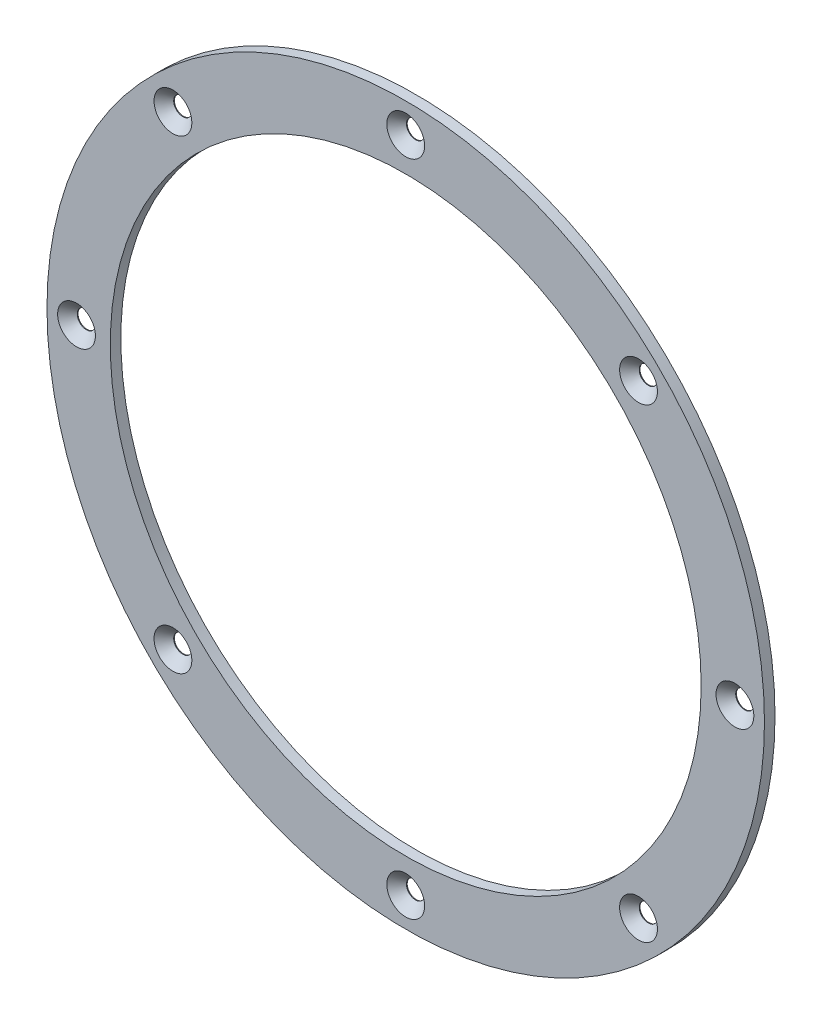
ISO-10303-21;
HEADER;
FILE_DESCRIPTION(('STEP AP214'),'2;1');
FILE_NAME('part.step','',(''),(''),'','','');
FILE_SCHEMA(('AUTOMOTIVE_DESIGN { 1 0 10303 214 1 1 1 1 }'));
ENDSEC;
DATA;
#1=APPLICATION_CONTEXT('core data for automotive mechanical design processes');
#2=APPLICATION_PROTOCOL_DEFINITION('international standard','automotive_design',2000,#1);
#3=PRODUCT_CONTEXT('',#1,'mechanical');
#4=PRODUCT('Part','Part','',(#3));
#5=PRODUCT_RELATED_PRODUCT_CATEGORY('part','',(#4));
#6=PRODUCT_DEFINITION_FORMATION('','',#4);
#7=PRODUCT_DEFINITION_CONTEXT('part definition',#1,'design');
#8=PRODUCT_DEFINITION('design','',#6,#7);
#9=PRODUCT_DEFINITION_SHAPE('','',#8);
#10=(LENGTH_UNIT() NAMED_UNIT(*) SI_UNIT(.MILLI.,.METRE.));
#11=(NAMED_UNIT(*) PLANE_ANGLE_UNIT() SI_UNIT($,.RADIAN.));
#12=(NAMED_UNIT(*) SI_UNIT($,.STERADIAN.) SOLID_ANGLE_UNIT());
#13=UNCERTAINTY_MEASURE_WITH_UNIT(LENGTH_MEASURE(1.E-05),#10,'distance_accuracy_value','');
#14=(GEOMETRIC_REPRESENTATION_CONTEXT(3) GLOBAL_UNCERTAINTY_ASSIGNED_CONTEXT((#13)) GLOBAL_UNIT_ASSIGNED_CONTEXT((#10,
#11,#12)) REPRESENTATION_CONTEXT('',''));
#15=CARTESIAN_POINT('',(0.,0.,0.));
#16=DIRECTION('',(0.,0.,1.));
#17=DIRECTION('',(1.,0.,0.));
#18=AXIS2_PLACEMENT_3D('',#15,#16,#17);
#19=CARTESIAN_POINT('',(0.,0.,-1.7));
#20=DIRECTION('',(0.,0.,1.));
#21=DIRECTION('',(1.,0.,0.));
#22=AXIS2_PLACEMENT_3D('',#19,#20,#21);
#23=PLANE('',#22);
#24=CARTESIAN_POINT('',(55.15432893255,55.1543289325514,-1.7));
#25=DIRECTION('',(0.,0.,1.));
#26=DIRECTION('',(1.,0.,0.));
#27=AXIS2_PLACEMENT_3D('',#24,#25,#26);
#28=CIRCLE('',#27,2.15);
#29=CARTESIAN_POINT('',(57.30432893255,55.1543289325514,-1.7));
#30=VERTEX_POINT('',#29);
#31=EDGE_CURVE('E350',#30,#30,#28,.T.);
#32=ORIENTED_EDGE('',*,*,#31,.T.);
#33=EDGE_LOOP('',(#32));
#34=FACE_BOUND('',#33,.T.);
#35=CARTESIAN_POINT('',(78.,8.17006633289293E-13,-1.7));
#36=DIRECTION('',(0.,0.,1.));
#37=DIRECTION('',(1.,0.,0.));
#38=AXIS2_PLACEMENT_3D('',#35,#36,#37);
#39=CIRCLE('',#38,2.15);
#40=CARTESIAN_POINT('',(80.15,8.17006633289293E-13,-1.7));
#41=VERTEX_POINT('',#40);
#42=EDGE_CURVE('E341',#41,#41,#39,.T.);
#43=ORIENTED_EDGE('',*,*,#42,.T.);
#44=EDGE_LOOP('',(#43));
#45=FACE_BOUND('',#44,.T.);
#46=CARTESIAN_POINT('',(55.1543289325512,-55.1543289325502,-1.7));
#47=DIRECTION('',(0.,0.,1.));
#48=DIRECTION('',(1.,0.,0.));
#49=AXIS2_PLACEMENT_3D('',#46,#47,#48);
#50=CIRCLE('',#49,2.15);
#51=CARTESIAN_POINT('',(57.3043289325512,-55.1543289325502,-1.7));
#52=VERTEX_POINT('',#51);
#53=EDGE_CURVE('E332',#52,#52,#50,.T.);
#54=ORIENTED_EDGE('',*,*,#53,.T.);
#55=EDGE_LOOP('',(#54));
#56=FACE_BOUND('',#55,.T.);
#57=CARTESIAN_POINT('',(0.,-78.,-1.7));
#58=DIRECTION('',(0.,0.,1.));
#59=DIRECTION('',(1.,0.,0.));
#60=AXIS2_PLACEMENT_3D('',#57,#58,#59);
#61=CIRCLE('',#60,2.15);
#62=CARTESIAN_POINT('',(2.15,-78.,-1.7));
#63=VERTEX_POINT('',#62);
#64=EDGE_CURVE('E323',#63,#63,#61,.T.);
#65=ORIENTED_EDGE('',*,*,#64,.T.);
#66=EDGE_LOOP('',(#65));
#67=FACE_BOUND('',#66,.T.);
#68=CARTESIAN_POINT('',(-55.1543289325504,-55.154328932551,-1.7));
#69=DIRECTION('',(0.,0.,1.));
#70=DIRECTION('',(1.,0.,0.));
#71=AXIS2_PLACEMENT_3D('',#68,#69,#70);
#72=CIRCLE('',#71,2.15);
#73=CARTESIAN_POINT('',(-53.0043289325504,-55.154328932551,-1.7));
#74=VERTEX_POINT('',#73);
#75=EDGE_CURVE('E314',#74,#74,#72,.T.);
#76=ORIENTED_EDGE('',*,*,#75,.T.);
#77=EDGE_LOOP('',(#76));
#78=FACE_BOUND('',#77,.T.);
#79=CARTESIAN_POINT('',(-78.,-2.72335544429764E-13,-1.7));
#80=DIRECTION('',(0.,0.,1.));
#81=DIRECTION('',(1.,0.,0.));
#82=AXIS2_PLACEMENT_3D('',#79,#80,#81);
#83=CIRCLE('',#82,2.15);
#84=CARTESIAN_POINT('',(-75.85,-2.72335544429764E-13,-1.7));
#85=VERTEX_POINT('',#84);
#86=EDGE_CURVE('E305',#85,#85,#83,.T.);
#87=ORIENTED_EDGE('',*,*,#86,.T.);
#88=EDGE_LOOP('',(#87));
#89=FACE_BOUND('',#88,.T.);
#90=CARTESIAN_POINT('',(-55.1543289325508,55.1543289325506,-1.7));
#91=DIRECTION('',(0.,0.,1.));
#92=DIRECTION('',(1.,0.,0.));
#93=AXIS2_PLACEMENT_3D('',#90,#91,#92);
#94=CIRCLE('',#93,2.15);
#95=CARTESIAN_POINT('',(-53.0043289325508,55.1543289325506,-1.7));
#96=VERTEX_POINT('',#95);
#97=EDGE_CURVE('E294',#96,#96,#94,.T.);
#98=ORIENTED_EDGE('',*,*,#97,.T.);
#99=EDGE_LOOP('',(#98));
#100=FACE_BOUND('',#99,.T.);
#101=CARTESIAN_POINT('',(0.,78.,-1.7));
#102=DIRECTION('',(0.,0.,1.));
#103=DIRECTION('',(1.,0.,0.));
#104=AXIS2_PLACEMENT_3D('',#101,#102,#103);
#105=CIRCLE('',#104,2.15);
#106=CARTESIAN_POINT('',(2.15,78.,-1.7));
#107=VERTEX_POINT('',#106);
#108=EDGE_CURVE('E82',#107,#107,#105,.T.);
#109=ORIENTED_EDGE('',*,*,#108,.T.);
#110=EDGE_LOOP('',(#109));
#111=FACE_BOUND('',#110,.T.);
#112=CARTESIAN_POINT('',(0.,0.,-1.7));
#113=DIRECTION('',(0.,0.,1.));
#114=DIRECTION('',(1.,0.,0.));
#115=AXIS2_PLACEMENT_3D('',#112,#113,#114);
#116=CIRCLE('',#115,70.);
#117=CARTESIAN_POINT('',(70.,0.,-1.7));
#118=VERTEX_POINT('',#117);
#119=EDGE_CURVE('E70',#118,#118,#116,.T.);
#120=ORIENTED_EDGE('',*,*,#119,.T.);
#121=EDGE_LOOP('',(#120));
#122=FACE_BOUND('',#121,.T.);
#123=CARTESIAN_POINT('',(0.,0.,-1.7));
#124=DIRECTION('',(0.,0.,1.));
#125=DIRECTION('',(1.,0.,0.));
#126=AXIS2_PLACEMENT_3D('',#123,#124,#125);
#127=CIRCLE('',#126,85.);
#128=CARTESIAN_POINT('',(85.,0.,-1.7));
#129=VERTEX_POINT('',#128);
#130=EDGE_CURVE('E13',#129,#129,#127,.T.);
#131=ORIENTED_EDGE('',*,*,#130,.F.);
#132=EDGE_LOOP('',(#131));
#133=FACE_BOUND('',#132,.T.);
#134=ADVANCED_FACE('F55',(#34,#45,#56,#67,#78,#89,#100,#111,#122,#133),#23,.F.);
#135=CARTESIAN_POINT('',(0.,0.,0.8));
#136=DIRECTION('',(0.,0.,1.));
#137=DIRECTION('',(1.,0.,0.));
#138=AXIS2_PLACEMENT_3D('',#135,#136,#137);
#139=PLANE('',#138);
#140=CARTESIAN_POINT('',(55.15432893255,55.1543289325514,0.8));
#141=DIRECTION('',(0.,0.,1.));
#142=DIRECTION('',(1.,0.,0.));
#143=AXIS2_PLACEMENT_3D('',#140,#141,#142);
#144=CIRCLE('',#143,4.48);
#145=CARTESIAN_POINT('',(59.63432893255,55.1543289325514,0.8));
#146=VERTEX_POINT('',#145);
#147=EDGE_CURVE('E356',#146,#146,#144,.T.);
#148=ORIENTED_EDGE('',*,*,#147,.F.);
#149=EDGE_LOOP('',(#148));
#150=FACE_BOUND('',#149,.T.);
#151=CARTESIAN_POINT('',(78.,8.17006633289293E-13,0.8));
#152=DIRECTION('',(0.,0.,1.));
#153=DIRECTION('',(1.,0.,0.));
#154=AXIS2_PLACEMENT_3D('',#151,#152,#153);
#155=CIRCLE('',#154,4.48);
#156=CARTESIAN_POINT('',(82.48,8.17006633289293E-13,0.8));
#157=VERTEX_POINT('',#156);
#158=EDGE_CURVE('E347',#157,#157,#155,.T.);
#159=ORIENTED_EDGE('',*,*,#158,.F.);
#160=EDGE_LOOP('',(#159));
#161=FACE_BOUND('',#160,.T.);
#162=CARTESIAN_POINT('',(55.1543289325512,-55.1543289325502,0.8));
#163=DIRECTION('',(0.,0.,1.));
#164=DIRECTION('',(1.,0.,0.));
#165=AXIS2_PLACEMENT_3D('',#162,#163,#164);
#166=CIRCLE('',#165,4.48);
#167=CARTESIAN_POINT('',(59.6343289325512,-55.1543289325502,0.8));
#168=VERTEX_POINT('',#167);
#169=EDGE_CURVE('E338',#168,#168,#166,.T.);
#170=ORIENTED_EDGE('',*,*,#169,.F.);
#171=EDGE_LOOP('',(#170));
#172=FACE_BOUND('',#171,.T.);
#173=CARTESIAN_POINT('',(0.,-78.,0.8));
#174=DIRECTION('',(0.,0.,1.));
#175=DIRECTION('',(1.,0.,0.));
#176=AXIS2_PLACEMENT_3D('',#173,#174,#175);
#177=CIRCLE('',#176,4.48);
#178=CARTESIAN_POINT('',(4.48,-78.,0.8));
#179=VERTEX_POINT('',#178);
#180=EDGE_CURVE('E329',#179,#179,#177,.T.);
#181=ORIENTED_EDGE('',*,*,#180,.F.);
#182=EDGE_LOOP('',(#181));
#183=FACE_BOUND('',#182,.T.);
#184=CARTESIAN_POINT('',(-55.1543289325504,-55.154328932551,0.8));
#185=DIRECTION('',(0.,0.,1.));
#186=DIRECTION('',(1.,0.,0.));
#187=AXIS2_PLACEMENT_3D('',#184,#185,#186);
#188=CIRCLE('',#187,4.48);
#189=CARTESIAN_POINT('',(-50.6743289325504,-55.154328932551,0.8));
#190=VERTEX_POINT('',#189);
#191=EDGE_CURVE('E320',#190,#190,#188,.T.);
#192=ORIENTED_EDGE('',*,*,#191,.F.);
#193=EDGE_LOOP('',(#192));
#194=FACE_BOUND('',#193,.T.);
#195=CARTESIAN_POINT('',(-78.,-2.72335544429764E-13,0.8));
#196=DIRECTION('',(0.,0.,1.));
#197=DIRECTION('',(1.,0.,0.));
#198=AXIS2_PLACEMENT_3D('',#195,#196,#197);
#199=CIRCLE('',#198,4.48);
#200=CARTESIAN_POINT('',(-73.52,-2.72335544429764E-13,0.8));
#201=VERTEX_POINT('',#200);
#202=EDGE_CURVE('E311',#201,#201,#199,.T.);
#203=ORIENTED_EDGE('',*,*,#202,.F.);
#204=EDGE_LOOP('',(#203));
#205=FACE_BOUND('',#204,.T.);
#206=CARTESIAN_POINT('',(-55.1543289325508,55.1543289325506,0.8));
#207=DIRECTION('',(0.,0.,1.));
#208=DIRECTION('',(1.,0.,0.));
#209=AXIS2_PLACEMENT_3D('',#206,#207,#208);
#210=CIRCLE('',#209,4.48);
#211=CARTESIAN_POINT('',(-50.6743289325508,55.1543289325506,0.8));
#212=VERTEX_POINT('',#211);
#213=EDGE_CURVE('E302',#212,#212,#210,.T.);
#214=ORIENTED_EDGE('',*,*,#213,.F.);
#215=EDGE_LOOP('',(#214));
#216=FACE_BOUND('',#215,.T.);
#217=CARTESIAN_POINT('',(0.,78.,0.8));
#218=DIRECTION('',(0.,0.,1.));
#219=DIRECTION('',(1.,0.,0.));
#220=AXIS2_PLACEMENT_3D('',#217,#218,#219);
#221=CIRCLE('',#220,4.48);
#222=CARTESIAN_POINT('',(4.48,78.,0.8));
#223=VERTEX_POINT('',#222);
#224=EDGE_CURVE('E290',#223,#223,#221,.T.);
#225=ORIENTED_EDGE('',*,*,#224,.F.);
#226=EDGE_LOOP('',(#225));
#227=FACE_BOUND('',#226,.T.);
#228=CARTESIAN_POINT('',(0.,0.,0.8));
#229=DIRECTION('',(0.,0.,1.));
#230=DIRECTION('',(1.,0.,0.));
#231=AXIS2_PLACEMENT_3D('',#228,#229,#230);
#232=CIRCLE('',#231,70.);
#233=CARTESIAN_POINT('',(70.,0.,0.8));
#234=VERTEX_POINT('',#233);
#235=EDGE_CURVE('E78',#234,#234,#232,.T.);
#236=ORIENTED_EDGE('',*,*,#235,.F.);
#237=EDGE_LOOP('',(#236));
#238=FACE_BOUND('',#237,.T.);
#239=CARTESIAN_POINT('',(0.,0.,0.8));
#240=DIRECTION('',(0.,0.,1.));
#241=DIRECTION('',(1.,0.,0.));
#242=AXIS2_PLACEMENT_3D('',#239,#240,#241);
#243=CIRCLE('',#242,85.);
#244=CARTESIAN_POINT('',(85.,0.,0.8));
#245=VERTEX_POINT('',#244);
#246=EDGE_CURVE('E62',#245,#245,#243,.T.);
#247=ORIENTED_EDGE('',*,*,#246,.T.);
#248=EDGE_LOOP('',(#247));
#249=FACE_BOUND('',#248,.T.);
#250=ADVANCED_FACE('F362',(#150,#161,#172,#183,#194,#205,#216,#227,#238,#249),#139,.T.);
#251=CARTESIAN_POINT('',(0.,0.,0.8));
#252=DIRECTION('',(0.,0.,-1.));
#253=DIRECTION('',(-1.,0.,0.));
#254=AXIS2_PLACEMENT_3D('',#251,#252,#253);
#255=CYLINDRICAL_SURFACE('',#254,85.);
#256=ORIENTED_EDGE('',*,*,#130,.T.);
#257=EDGE_LOOP('',(#256));
#258=FACE_BOUND('',#257,.T.);
#259=ORIENTED_EDGE('',*,*,#246,.F.);
#260=EDGE_LOOP('',(#259));
#261=FACE_BOUND('',#260,.T.);
#262=ADVANCED_FACE('F365',(#258,#261),#255,.T.);
#263=CARTESIAN_POINT('',(0.,0.,0.8));
#264=DIRECTION('',(0.,0.,-1.));
#265=DIRECTION('',(-1.,0.,0.));
#266=AXIS2_PLACEMENT_3D('',#263,#264,#265);
#267=CYLINDRICAL_SURFACE('',#266,70.);
#268=ORIENTED_EDGE('',*,*,#119,.F.);
#269=EDGE_LOOP('',(#268));
#270=FACE_BOUND('',#269,.T.);
#271=ORIENTED_EDGE('',*,*,#235,.T.);
#272=EDGE_LOOP('',(#271));
#273=FACE_BOUND('',#272,.T.);
#274=ADVANCED_FACE('F395',(#270,#273),#267,.F.);
#275=CARTESIAN_POINT('',(0.,78.,0.8));
#276=DIRECTION('',(0.,0.,1.));
#277=DIRECTION('',(1.,0.,0.));
#278=AXIS2_PLACEMENT_3D('',#275,#276,#277);
#279=CYLINDRICAL_SURFACE('',#278,2.15);
#280=ORIENTED_EDGE('',*,*,#108,.F.);
#281=EDGE_LOOP('',(#280));
#282=FACE_BOUND('',#281,.T.);
#283=CARTESIAN_POINT('',(0.,78.,-1.53));
#284=DIRECTION('',(0.,0.,1.));
#285=DIRECTION('',(1.,0.,0.));
#286=AXIS2_PLACEMENT_3D('',#283,#284,#285);
#287=CIRCLE('',#286,2.15);
#288=CARTESIAN_POINT('',(2.15,78.,-1.53));
#289=VERTEX_POINT('',#288);
#290=EDGE_CURVE('E286',#289,#289,#287,.T.);
#291=ORIENTED_EDGE('',*,*,#290,.T.);
#292=EDGE_LOOP('',(#291));
#293=FACE_BOUND('',#292,.T.);
#294=ADVANCED_FACE('F385',(#282,#293),#279,.F.);
#295=CARTESIAN_POINT('',(0.,78.,0.8));
#296=DIRECTION('',(0.,0.,1.));
#297=DIRECTION('',(1.,0.,0.));
#298=AXIS2_PLACEMENT_3D('',#295,#296,#297);
#299=CONICAL_SURFACE('',#298,4.48,0.785398163397448);
#300=ORIENTED_EDGE('',*,*,#290,.F.);
#301=EDGE_LOOP('',(#300));
#302=FACE_BOUND('',#301,.T.);
#303=ORIENTED_EDGE('',*,*,#224,.T.);
#304=EDGE_LOOP('',(#303));
#305=FACE_BOUND('',#304,.T.);
#306=ADVANCED_FACE('F382',(#302,#305),#299,.F.);
#307=CARTESIAN_POINT('',(-55.1543289325508,55.1543289325506,0.8));
#308=DIRECTION('',(0.,0.,1.));
#309=DIRECTION('',(1.,0.,0.));
#310=AXIS2_PLACEMENT_3D('',#307,#308,#309);
#311=CYLINDRICAL_SURFACE('',#310,2.15);
#312=ORIENTED_EDGE('',*,*,#97,.F.);
#313=EDGE_LOOP('',(#312));
#314=FACE_BOUND('',#313,.T.);
#315=CARTESIAN_POINT('',(-55.1543289325508,55.1543289325506,-1.53));
#316=DIRECTION('',(0.,0.,1.));
#317=DIRECTION('',(1.,0.,0.));
#318=AXIS2_PLACEMENT_3D('',#315,#316,#317);
#319=CIRCLE('',#318,2.15);
#320=CARTESIAN_POINT('',(-53.0043289325508,55.1543289325506,-1.53));
#321=VERTEX_POINT('',#320);
#322=EDGE_CURVE('E299',#321,#321,#319,.T.);
#323=ORIENTED_EDGE('',*,*,#322,.T.);
#324=EDGE_LOOP('',(#323));
#325=FACE_BOUND('',#324,.T.);
#326=ADVANCED_FACE('F384',(#314,#325),#311,.F.);
#327=CARTESIAN_POINT('',(-55.1543289325508,55.1543289325506,0.8));
#328=DIRECTION('',(0.,0.,1.));
#329=DIRECTION('',(1.,0.,0.));
#330=AXIS2_PLACEMENT_3D('',#327,#328,#329);
#331=CONICAL_SURFACE('',#330,4.48,0.785398163397448);
#332=ORIENTED_EDGE('',*,*,#322,.F.);
#333=EDGE_LOOP('',(#332));
#334=FACE_BOUND('',#333,.T.);
#335=ORIENTED_EDGE('',*,*,#213,.T.);
#336=EDGE_LOOP('',(#335));
#337=FACE_BOUND('',#336,.T.);
#338=ADVANCED_FACE('F392',(#334,#337),#331,.F.);
#339=CARTESIAN_POINT('',(-78.,-2.72335544429764E-13,0.8));
#340=DIRECTION('',(0.,0.,1.));
#341=DIRECTION('',(1.,0.,0.));
#342=AXIS2_PLACEMENT_3D('',#339,#340,#341);
#343=CYLINDRICAL_SURFACE('',#342,2.15);
#344=ORIENTED_EDGE('',*,*,#86,.F.);
#345=EDGE_LOOP('',(#344));
#346=FACE_BOUND('',#345,.T.);
#347=CARTESIAN_POINT('',(-78.,-2.72335544429764E-13,-1.53));
#348=DIRECTION('',(0.,0.,1.));
#349=DIRECTION('',(1.,0.,0.));
#350=AXIS2_PLACEMENT_3D('',#347,#348,#349);
#351=CIRCLE('',#350,2.15);
#352=CARTESIAN_POINT('',(-75.85,-2.72335544429764E-13,-1.53));
#353=VERTEX_POINT('',#352);
#354=EDGE_CURVE('E308',#353,#353,#351,.T.);
#355=ORIENTED_EDGE('',*,*,#354,.T.);
#356=EDGE_LOOP('',(#355));
#357=FACE_BOUND('',#356,.T.);
#358=ADVANCED_FACE('F450',(#346,#357),#343,.F.);
#359=CARTESIAN_POINT('',(-78.,-2.72335544429764E-13,0.8));
#360=DIRECTION('',(0.,0.,1.));
#361=DIRECTION('',(1.,0.,0.));
#362=AXIS2_PLACEMENT_3D('',#359,#360,#361);
#363=CONICAL_SURFACE('',#362,4.48,0.785398163397448);
#364=ORIENTED_EDGE('',*,*,#354,.F.);
#365=EDGE_LOOP('',(#364));
#366=FACE_BOUND('',#365,.T.);
#367=ORIENTED_EDGE('',*,*,#202,.T.);
#368=EDGE_LOOP('',(#367));
#369=FACE_BOUND('',#368,.T.);
#370=ADVANCED_FACE('F461',(#366,#369),#363,.F.);
#371=CARTESIAN_POINT('',(-55.1543289325504,-55.154328932551,0.8));
#372=DIRECTION('',(0.,0.,1.));
#373=DIRECTION('',(1.,0.,0.));
#374=AXIS2_PLACEMENT_3D('',#371,#372,#373);
#375=CYLINDRICAL_SURFACE('',#374,2.15);
#376=ORIENTED_EDGE('',*,*,#75,.F.);
#377=EDGE_LOOP('',(#376));
#378=FACE_BOUND('',#377,.T.);
#379=CARTESIAN_POINT('',(-55.1543289325504,-55.154328932551,-1.53));
#380=DIRECTION('',(0.,0.,1.));
#381=DIRECTION('',(1.,0.,0.));
#382=AXIS2_PLACEMENT_3D('',#379,#380,#381);
#383=CIRCLE('',#382,2.15);
#384=CARTESIAN_POINT('',(-53.0043289325504,-55.154328932551,-1.53));
#385=VERTEX_POINT('',#384);
#386=EDGE_CURVE('E317',#385,#385,#383,.T.);
#387=ORIENTED_EDGE('',*,*,#386,.T.);
#388=EDGE_LOOP('',(#387));
#389=FACE_BOUND('',#388,.T.);
#390=ADVANCED_FACE('F472',(#378,#389),#375,.F.);
#391=CARTESIAN_POINT('',(-55.1543289325504,-55.154328932551,0.8));
#392=DIRECTION('',(0.,0.,1.));
#393=DIRECTION('',(1.,0.,0.));
#394=AXIS2_PLACEMENT_3D('',#391,#392,#393);
#395=CONICAL_SURFACE('',#394,4.48,0.785398163397448);
#396=ORIENTED_EDGE('',*,*,#386,.F.);
#397=EDGE_LOOP('',(#396));
#398=FACE_BOUND('',#397,.T.);
#399=ORIENTED_EDGE('',*,*,#191,.T.);
#400=EDGE_LOOP('',(#399));
#401=FACE_BOUND('',#400,.T.);
#402=ADVANCED_FACE('F483',(#398,#401),#395,.F.);
#403=CARTESIAN_POINT('',(0.,-78.,0.8));
#404=DIRECTION('',(0.,0.,1.));
#405=DIRECTION('',(1.,0.,0.));
#406=AXIS2_PLACEMENT_3D('',#403,#404,#405);
#407=CYLINDRICAL_SURFACE('',#406,2.15);
#408=ORIENTED_EDGE('',*,*,#64,.F.);
#409=EDGE_LOOP('',(#408));
#410=FACE_BOUND('',#409,.T.);
#411=CARTESIAN_POINT('',(0.,-78.,-1.53));
#412=DIRECTION('',(0.,0.,1.));
#413=DIRECTION('',(1.,0.,0.));
#414=AXIS2_PLACEMENT_3D('',#411,#412,#413);
#415=CIRCLE('',#414,2.15);
#416=CARTESIAN_POINT('',(2.15,-78.,-1.53));
#417=VERTEX_POINT('',#416);
#418=EDGE_CURVE('E326',#417,#417,#415,.T.);
#419=ORIENTED_EDGE('',*,*,#418,.T.);
#420=EDGE_LOOP('',(#419));
#421=FACE_BOUND('',#420,.T.);
#422=ADVANCED_FACE('F494',(#410,#421),#407,.F.);
#423=CARTESIAN_POINT('',(0.,-78.,0.8));
#424=DIRECTION('',(0.,0.,1.));
#425=DIRECTION('',(1.,0.,0.));
#426=AXIS2_PLACEMENT_3D('',#423,#424,#425);
#427=CONICAL_SURFACE('',#426,4.48,0.785398163397448);
#428=ORIENTED_EDGE('',*,*,#418,.F.);
#429=EDGE_LOOP('',(#428));
#430=FACE_BOUND('',#429,.T.);
#431=ORIENTED_EDGE('',*,*,#180,.T.);
#432=EDGE_LOOP('',(#431));
#433=FACE_BOUND('',#432,.T.);
#434=ADVANCED_FACE('F505',(#430,#433),#427,.F.);
#435=CARTESIAN_POINT('',(55.1543289325512,-55.1543289325502,0.8));
#436=DIRECTION('',(0.,0.,1.));
#437=DIRECTION('',(1.,0.,0.));
#438=AXIS2_PLACEMENT_3D('',#435,#436,#437);
#439=CYLINDRICAL_SURFACE('',#438,2.15);
#440=ORIENTED_EDGE('',*,*,#53,.F.);
#441=EDGE_LOOP('',(#440));
#442=FACE_BOUND('',#441,.T.);
#443=CARTESIAN_POINT('',(55.1543289325512,-55.1543289325502,-1.53));
#444=DIRECTION('',(0.,0.,1.));
#445=DIRECTION('',(1.,0.,0.));
#446=AXIS2_PLACEMENT_3D('',#443,#444,#445);
#447=CIRCLE('',#446,2.15);
#448=CARTESIAN_POINT('',(57.3043289325512,-55.1543289325502,-1.53));
#449=VERTEX_POINT('',#448);
#450=EDGE_CURVE('E335',#449,#449,#447,.T.);
#451=ORIENTED_EDGE('',*,*,#450,.T.);
#452=EDGE_LOOP('',(#451));
#453=FACE_BOUND('',#452,.T.);
#454=ADVANCED_FACE('F516',(#442,#453),#439,.F.);
#455=CARTESIAN_POINT('',(55.1543289325512,-55.1543289325502,0.8));
#456=DIRECTION('',(0.,0.,1.));
#457=DIRECTION('',(1.,0.,0.));
#458=AXIS2_PLACEMENT_3D('',#455,#456,#457);
#459=CONICAL_SURFACE('',#458,4.48,0.785398163397448);
#460=ORIENTED_EDGE('',*,*,#450,.F.);
#461=EDGE_LOOP('',(#460));
#462=FACE_BOUND('',#461,.T.);
#463=ORIENTED_EDGE('',*,*,#169,.T.);
#464=EDGE_LOOP('',(#463));
#465=FACE_BOUND('',#464,.T.);
#466=ADVANCED_FACE('F527',(#462,#465),#459,.F.);
#467=CARTESIAN_POINT('',(78.,8.17006633289293E-13,0.8));
#468=DIRECTION('',(0.,0.,1.));
#469=DIRECTION('',(1.,0.,0.));
#470=AXIS2_PLACEMENT_3D('',#467,#468,#469);
#471=CYLINDRICAL_SURFACE('',#470,2.15);
#472=ORIENTED_EDGE('',*,*,#42,.F.);
#473=EDGE_LOOP('',(#472));
#474=FACE_BOUND('',#473,.T.);
#475=CARTESIAN_POINT('',(78.,8.17006633289293E-13,-1.53));
#476=DIRECTION('',(0.,0.,1.));
#477=DIRECTION('',(1.,0.,0.));
#478=AXIS2_PLACEMENT_3D('',#475,#476,#477);
#479=CIRCLE('',#478,2.15);
#480=CARTESIAN_POINT('',(80.15,8.17006633289293E-13,-1.53));
#481=VERTEX_POINT('',#480);
#482=EDGE_CURVE('E344',#481,#481,#479,.T.);
#483=ORIENTED_EDGE('',*,*,#482,.T.);
#484=EDGE_LOOP('',(#483));
#485=FACE_BOUND('',#484,.T.);
#486=ADVANCED_FACE('F538',(#474,#485),#471,.F.);
#487=CARTESIAN_POINT('',(78.,8.17006633289293E-13,0.8));
#488=DIRECTION('',(0.,0.,1.));
#489=DIRECTION('',(1.,0.,0.));
#490=AXIS2_PLACEMENT_3D('',#487,#488,#489);
#491=CONICAL_SURFACE('',#490,4.48,0.785398163397448);
#492=ORIENTED_EDGE('',*,*,#482,.F.);
#493=EDGE_LOOP('',(#492));
#494=FACE_BOUND('',#493,.T.);
#495=ORIENTED_EDGE('',*,*,#158,.T.);
#496=EDGE_LOOP('',(#495));
#497=FACE_BOUND('',#496,.T.);
#498=ADVANCED_FACE('F549',(#494,#497),#491,.F.);
#499=CARTESIAN_POINT('',(55.15432893255,55.1543289325514,0.8));
#500=DIRECTION('',(0.,0.,1.));
#501=DIRECTION('',(1.,0.,0.));
#502=AXIS2_PLACEMENT_3D('',#499,#500,#501);
#503=CYLINDRICAL_SURFACE('',#502,2.15);
#504=ORIENTED_EDGE('',*,*,#31,.F.);
#505=EDGE_LOOP('',(#504));
#506=FACE_BOUND('',#505,.T.);
#507=CARTESIAN_POINT('',(55.15432893255,55.1543289325514,-1.53));
#508=DIRECTION('',(0.,0.,1.));
#509=DIRECTION('',(1.,0.,0.));
#510=AXIS2_PLACEMENT_3D('',#507,#508,#509);
#511=CIRCLE('',#510,2.15);
#512=CARTESIAN_POINT('',(57.30432893255,55.1543289325514,-1.53));
#513=VERTEX_POINT('',#512);
#514=EDGE_CURVE('E353',#513,#513,#511,.T.);
#515=ORIENTED_EDGE('',*,*,#514,.T.);
#516=EDGE_LOOP('',(#515));
#517=FACE_BOUND('',#516,.T.);
#518=ADVANCED_FACE('F560',(#506,#517),#503,.F.);
#519=CARTESIAN_POINT('',(55.15432893255,55.1543289325514,0.8));
#520=DIRECTION('',(0.,0.,1.));
#521=DIRECTION('',(1.,0.,0.));
#522=AXIS2_PLACEMENT_3D('',#519,#520,#521);
#523=CONICAL_SURFACE('',#522,4.48,0.785398163397448);
#524=ORIENTED_EDGE('',*,*,#514,.F.);
#525=EDGE_LOOP('',(#524));
#526=FACE_BOUND('',#525,.T.);
#527=ORIENTED_EDGE('',*,*,#147,.T.);
#528=EDGE_LOOP('',(#527));
#529=FACE_BOUND('',#528,.T.);
#530=ADVANCED_FACE('F360',(#526,#529),#523,.F.);
#531=CLOSED_SHELL('',(#134,#250,#262,#274,#294,#306,#326,#338,#358,#370,#390,#402,#422,#434,
#454,#466,#486,#498,#518,#530));
#532=MANIFOLD_SOLID_BREP('B2',#531);
#533=ADVANCED_BREP_SHAPE_REPRESENTATION('',(#18,#532),#14);
#534=SHAPE_DEFINITION_REPRESENTATION(#9,#533);
ENDSEC;
END-ISO-10303-21;
